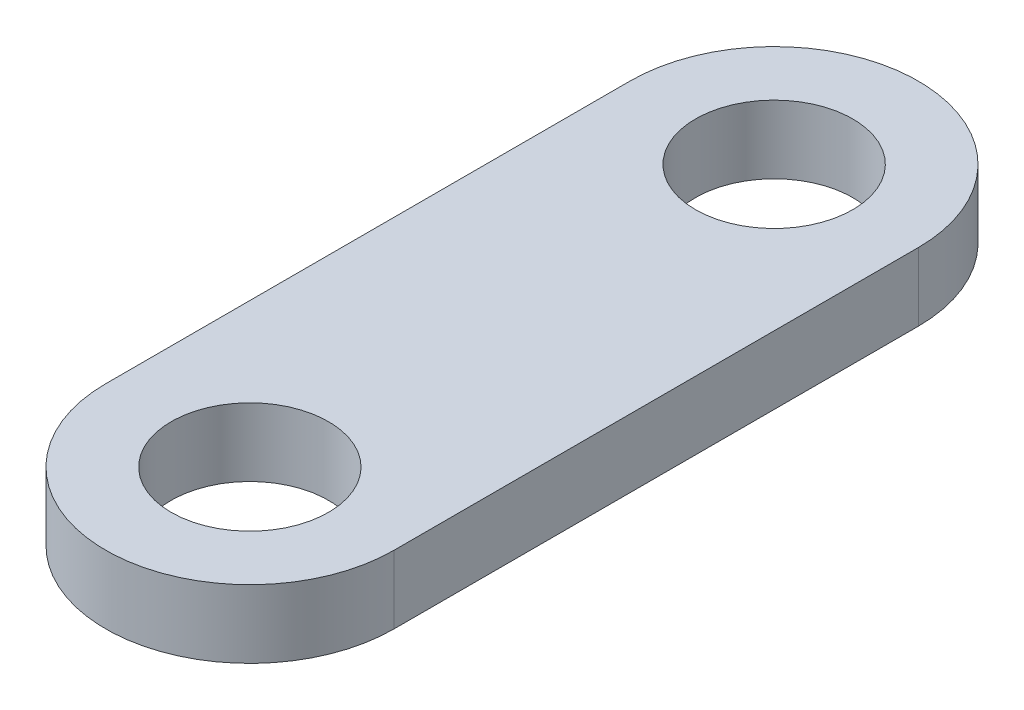
ISO-10303-21;
HEADER;
FILE_DESCRIPTION(('STEP AP214'),'2;1');
FILE_NAME('part.step','',(''),(''),'','','');
FILE_SCHEMA(('AUTOMOTIVE_DESIGN { 1 0 10303 214 1 1 1 1 }'));
ENDSEC;
DATA;
#1=APPLICATION_CONTEXT('core data for automotive mechanical design processes');
#2=APPLICATION_PROTOCOL_DEFINITION('international standard','automotive_design',2000,#1);
#3=PRODUCT_CONTEXT('',#1,'mechanical');
#4=PRODUCT('Part','Part','',(#3));
#5=PRODUCT_RELATED_PRODUCT_CATEGORY('part','',(#4));
#6=PRODUCT_DEFINITION_FORMATION('','',#4);
#7=PRODUCT_DEFINITION_CONTEXT('part definition',#1,'design');
#8=PRODUCT_DEFINITION('design','',#6,#7);
#9=PRODUCT_DEFINITION_SHAPE('','',#8);
#10=(LENGTH_UNIT() NAMED_UNIT(*) SI_UNIT(.MILLI.,.METRE.));
#11=(NAMED_UNIT(*) PLANE_ANGLE_UNIT() SI_UNIT($,.RADIAN.));
#12=(NAMED_UNIT(*) SI_UNIT($,.STERADIAN.) SOLID_ANGLE_UNIT());
#13=UNCERTAINTY_MEASURE_WITH_UNIT(LENGTH_MEASURE(1.E-05),#10,'distance_accuracy_value','');
#14=(GEOMETRIC_REPRESENTATION_CONTEXT(3) GLOBAL_UNCERTAINTY_ASSIGNED_CONTEXT((#13)) GLOBAL_UNIT_ASSIGNED_CONTEXT((#10,
#11,#12)) REPRESENTATION_CONTEXT('',''));
#15=CARTESIAN_POINT('',(0.,0.,0.));
#16=DIRECTION('',(0.,0.,1.));
#17=DIRECTION('',(1.,0.,0.));
#18=AXIS2_PLACEMENT_3D('',#15,#16,#17);
#19=CARTESIAN_POINT('',(0.,2.6,-12.3976948235474));
#20=DIRECTION('',(0.,1.,0.));
#21=DIRECTION('',(0.,0.,1.));
#22=AXIS2_PLACEMENT_3D('',#19,#20,#21);
#23=PLANE('',#22);
#24=CARTESIAN_POINT('',(0.,2.6,-12.3976948235474));
#25=DIRECTION('',(0.,1.,0.));
#26=DIRECTION('',(0.,0.,1.));
#27=AXIS2_PLACEMENT_3D('',#24,#25,#26);
#28=CIRCLE('',#27,3.);
#29=CARTESIAN_POINT('',(0.,2.6,-9.39769482354739));
#30=VERTEX_POINT('',#29);
#31=EDGE_CURVE('E106',#30,#30,#28,.T.);
#32=ORIENTED_EDGE('',*,*,#31,.F.);
#33=EDGE_LOOP('',(#32));
#34=FACE_BOUND('',#33,.T.);
#35=CARTESIAN_POINT('',(0.,2.6,-12.3976948235474));
#36=DIRECTION('',(0.,1.,0.));
#37=DIRECTION('',(0.,0.,1.));
#38=AXIS2_PLACEMENT_3D('',#35,#36,#37);
#39=CIRCLE('',#38,5.5);
#40=CARTESIAN_POINT('',(5.5,2.6,-12.3976948235474));
#41=VERTEX_POINT('',#40);
#42=CARTESIAN_POINT('',(-5.5,2.6,-12.3976948235474));
#43=VERTEX_POINT('',#42);
#44=EDGE_CURVE('E91',#41,#43,#39,.T.);
#45=ORIENTED_EDGE('',*,*,#44,.T.);
#46=DIRECTION('',(0.,0.,1.));
#47=VECTOR('',#46,1.);
#48=CARTESIAN_POINT('',(-5.5,2.6,-12.3976948235474));
#49=LINE('',#48,#47);
#50=CARTESIAN_POINT('',(-5.5,2.6,7.60230517645261));
#51=VERTEX_POINT('',#50);
#52=EDGE_CURVE('E86',#43,#51,#49,.T.);
#53=ORIENTED_EDGE('',*,*,#52,.T.);
#54=CARTESIAN_POINT('',(0.,2.6,7.60230517645261));
#55=DIRECTION('',(0.,1.,0.));
#56=DIRECTION('',(0.,0.,1.));
#57=AXIS2_PLACEMENT_3D('',#54,#55,#56);
#58=CIRCLE('',#57,5.5);
#59=CARTESIAN_POINT('',(5.5,2.6,7.60230517645261));
#60=VERTEX_POINT('',#59);
#61=EDGE_CURVE('E87',#51,#60,#58,.T.);
#62=ORIENTED_EDGE('',*,*,#61,.T.);
#63=DIRECTION('',(0.,0.,-1.));
#64=VECTOR('',#63,1.);
#65=CARTESIAN_POINT('',(5.5,2.6,-12.3976948235474));
#66=LINE('',#65,#64);
#67=EDGE_CURVE('E57',#60,#41,#66,.T.);
#68=ORIENTED_EDGE('',*,*,#67,.T.);
#69=EDGE_LOOP('',(#45,#53,#62,#68));
#70=FACE_BOUND('',#69,.T.);
#71=CARTESIAN_POINT('',(0.,2.6,7.60230517645261));
#72=DIRECTION('',(0.,1.,0.));
#73=DIRECTION('',(0.,0.,1.));
#74=AXIS2_PLACEMENT_3D('',#71,#72,#73);
#75=CIRCLE('',#74,3.);
#76=CARTESIAN_POINT('',(0.,2.6,10.6023051764526));
#77=VERTEX_POINT('',#76);
#78=EDGE_CURVE('E123',#77,#77,#75,.T.);
#79=ORIENTED_EDGE('',*,*,#78,.F.);
#80=EDGE_LOOP('',(#79));
#81=FACE_BOUND('',#80,.T.);
#82=ADVANCED_FACE('F39',(#34,#70,#81),#23,.T.);
#83=CARTESIAN_POINT('',(0.,0.,-12.3976948235474));
#84=DIRECTION('',(0.,1.,0.));
#85=DIRECTION('',(0.,0.,1.));
#86=AXIS2_PLACEMENT_3D('',#83,#84,#85);
#87=PLANE('',#86);
#88=CARTESIAN_POINT('',(0.,0.,-12.3976948235474));
#89=DIRECTION('',(0.,1.,0.));
#90=DIRECTION('',(0.,0.,1.));
#91=AXIS2_PLACEMENT_3D('',#88,#89,#90);
#92=CIRCLE('',#91,5.5);
#93=CARTESIAN_POINT('',(5.5,0.,-12.3976948235474));
#94=VERTEX_POINT('',#93);
#95=CARTESIAN_POINT('',(-5.5,0.,-12.3976948235474));
#96=VERTEX_POINT('',#95);
#97=EDGE_CURVE('E104',#94,#96,#92,.T.);
#98=ORIENTED_EDGE('',*,*,#97,.F.);
#99=DIRECTION('',(0.,0.,-1.));
#100=VECTOR('',#99,1.);
#101=CARTESIAN_POINT('',(5.5,0.,-12.3976948235474));
#102=LINE('',#101,#100);
#103=CARTESIAN_POINT('',(5.5,0.,7.60230517645261));
#104=VERTEX_POINT('',#103);
#105=EDGE_CURVE('E80',#104,#94,#102,.T.);
#106=ORIENTED_EDGE('',*,*,#105,.F.);
#107=CARTESIAN_POINT('',(0.,0.,7.60230517645261));
#108=DIRECTION('',(0.,1.,0.));
#109=DIRECTION('',(0.,0.,1.));
#110=AXIS2_PLACEMENT_3D('',#107,#108,#109);
#111=CIRCLE('',#110,5.5);
#112=CARTESIAN_POINT('',(-5.5,0.,7.60230517645261));
#113=VERTEX_POINT('',#112);
#114=EDGE_CURVE('E74',#113,#104,#111,.T.);
#115=ORIENTED_EDGE('',*,*,#114,.F.);
#116=DIRECTION('',(0.,0.,1.));
#117=VECTOR('',#116,1.);
#118=CARTESIAN_POINT('',(-5.5,0.,-12.3976948235474));
#119=LINE('',#118,#117);
#120=EDGE_CURVE('E94',#96,#113,#119,.T.);
#121=ORIENTED_EDGE('',*,*,#120,.F.);
#122=EDGE_LOOP('',(#98,#106,#115,#121));
#123=FACE_BOUND('',#122,.T.);
#124=CARTESIAN_POINT('',(0.,0.,-12.3976948235474));
#125=DIRECTION('',(0.,1.,0.));
#126=DIRECTION('',(0.,0.,1.));
#127=AXIS2_PLACEMENT_3D('',#124,#125,#126);
#128=CIRCLE('',#127,3.);
#129=CARTESIAN_POINT('',(0.,0.,-9.39769482354739));
#130=VERTEX_POINT('',#129);
#131=EDGE_CURVE('E119',#130,#130,#128,.T.);
#132=ORIENTED_EDGE('',*,*,#131,.T.);
#133=EDGE_LOOP('',(#132));
#134=FACE_BOUND('',#133,.T.);
#135=CARTESIAN_POINT('',(0.,0.,7.60230517645261));
#136=DIRECTION('',(0.,1.,0.));
#137=DIRECTION('',(0.,0.,1.));
#138=AXIS2_PLACEMENT_3D('',#135,#136,#137);
#139=CIRCLE('',#138,3.);
#140=CARTESIAN_POINT('',(0.,0.,10.6023051764526));
#141=VERTEX_POINT('',#140);
#142=EDGE_CURVE('E125',#141,#141,#139,.T.);
#143=ORIENTED_EDGE('',*,*,#142,.T.);
#144=EDGE_LOOP('',(#143));
#145=FACE_BOUND('',#144,.T.);
#146=ADVANCED_FACE('F114',(#123,#134,#145),#87,.F.);
#147=CARTESIAN_POINT('',(0.,2.6,-12.3976948235474));
#148=DIRECTION('',(0.,-1.,0.));
#149=DIRECTION('',(0.,0.,-1.));
#150=AXIS2_PLACEMENT_3D('',#147,#148,#149);
#151=CYLINDRICAL_SURFACE('',#150,5.5);
#152=ORIENTED_EDGE('',*,*,#97,.T.);
#153=DIRECTION('',(0.,-1.,0.));
#154=VECTOR('',#153,1.);
#155=CARTESIAN_POINT('',(-5.5,2.6,-12.3976948235474));
#156=LINE('',#155,#154);
#157=EDGE_CURVE('E11',#43,#96,#156,.T.);
#158=ORIENTED_EDGE('',*,*,#157,.F.);
#159=ORIENTED_EDGE('',*,*,#44,.F.);
#160=DIRECTION('',(0.,-1.,0.));
#161=VECTOR('',#160,1.);
#162=CARTESIAN_POINT('',(5.5,2.6,-12.3976948235474));
#163=LINE('',#162,#161);
#164=EDGE_CURVE('E98',#41,#94,#163,.T.);
#165=ORIENTED_EDGE('',*,*,#164,.T.);
#166=EDGE_LOOP('',(#152,#158,#159,#165));
#167=FACE_BOUND('',#166,.T.);
#168=ADVANCED_FACE('F41',(#167),#151,.T.);
#169=CARTESIAN_POINT('',(-5.5,2.6,-12.3976948235474));
#170=DIRECTION('',(1.,0.,0.));
#171=DIRECTION('',(0.,0.,-1.));
#172=AXIS2_PLACEMENT_3D('',#169,#170,#171);
#173=PLANE('',#172);
#174=ORIENTED_EDGE('',*,*,#120,.T.);
#175=DIRECTION('',(0.,-1.,0.));
#176=VECTOR('',#175,1.);
#177=CARTESIAN_POINT('',(-5.5,2.6,7.60230517645261));
#178=LINE('',#177,#176);
#179=EDGE_CURVE('E48',#51,#113,#178,.T.);
#180=ORIENTED_EDGE('',*,*,#179,.F.);
#181=ORIENTED_EDGE('',*,*,#52,.F.);
#182=ORIENTED_EDGE('',*,*,#157,.T.);
#183=EDGE_LOOP('',(#174,#180,#181,#182));
#184=FACE_BOUND('',#183,.T.);
#185=ADVANCED_FACE('F92',(#184),#173,.F.);
#186=CARTESIAN_POINT('',(0.,2.6,7.60230517645261));
#187=DIRECTION('',(0.,-1.,0.));
#188=DIRECTION('',(0.,0.,-1.));
#189=AXIS2_PLACEMENT_3D('',#186,#187,#188);
#190=CYLINDRICAL_SURFACE('',#189,5.5);
#191=ORIENTED_EDGE('',*,*,#114,.T.);
#192=DIRECTION('',(0.,-1.,0.));
#193=VECTOR('',#192,1.);
#194=CARTESIAN_POINT('',(5.5,2.6,7.60230517645261));
#195=LINE('',#194,#193);
#196=EDGE_CURVE('E96',#60,#104,#195,.T.);
#197=ORIENTED_EDGE('',*,*,#196,.F.);
#198=ORIENTED_EDGE('',*,*,#61,.F.);
#199=ORIENTED_EDGE('',*,*,#179,.T.);
#200=EDGE_LOOP('',(#191,#197,#198,#199));
#201=FACE_BOUND('',#200,.T.);
#202=ADVANCED_FACE('F100',(#201),#190,.T.);
#203=CARTESIAN_POINT('',(5.5,2.6,-12.3976948235474));
#204=DIRECTION('',(-1.,0.,0.));
#205=DIRECTION('',(0.,0.,1.));
#206=AXIS2_PLACEMENT_3D('',#203,#204,#205);
#207=PLANE('',#206);
#208=ORIENTED_EDGE('',*,*,#105,.T.);
#209=ORIENTED_EDGE('',*,*,#164,.F.);
#210=ORIENTED_EDGE('',*,*,#67,.F.);
#211=ORIENTED_EDGE('',*,*,#196,.T.);
#212=EDGE_LOOP('',(#208,#209,#210,#211));
#213=FACE_BOUND('',#212,.T.);
#214=ADVANCED_FACE('F112',(#213),#207,.F.);
#215=CARTESIAN_POINT('',(0.,2.6,-12.3976948235474));
#216=DIRECTION('',(0.,-1.,0.));
#217=DIRECTION('',(0.,0.,-1.));
#218=AXIS2_PLACEMENT_3D('',#215,#216,#217);
#219=CYLINDRICAL_SURFACE('',#218,3.);
#220=ORIENTED_EDGE('',*,*,#31,.T.);
#221=EDGE_LOOP('',(#220));
#222=FACE_BOUND('',#221,.T.);
#223=ORIENTED_EDGE('',*,*,#131,.F.);
#224=EDGE_LOOP('',(#223));
#225=FACE_BOUND('',#224,.T.);
#226=ADVANCED_FACE('F141',(#222,#225),#219,.F.);
#227=CARTESIAN_POINT('',(0.,2.6,7.60230517645261));
#228=DIRECTION('',(0.,-1.,0.));
#229=DIRECTION('',(0.,0.,-1.));
#230=AXIS2_PLACEMENT_3D('',#227,#228,#229);
#231=CYLINDRICAL_SURFACE('',#230,3.);
#232=ORIENTED_EDGE('',*,*,#78,.T.);
#233=EDGE_LOOP('',(#232));
#234=FACE_BOUND('',#233,.T.);
#235=ORIENTED_EDGE('',*,*,#142,.F.);
#236=EDGE_LOOP('',(#235));
#237=FACE_BOUND('',#236,.T.);
#238=ADVANCED_FACE('F127',(#234,#237),#231,.F.);
#239=CLOSED_SHELL('',(#82,#146,#168,#185,#202,#214,#226,#238));
#240=MANIFOLD_SOLID_BREP('B2',#239);
#241=ADVANCED_BREP_SHAPE_REPRESENTATION('',(#18,#240),#14);
#242=SHAPE_DEFINITION_REPRESENTATION(#9,#241);
ENDSEC;
END-ISO-10303-21;
